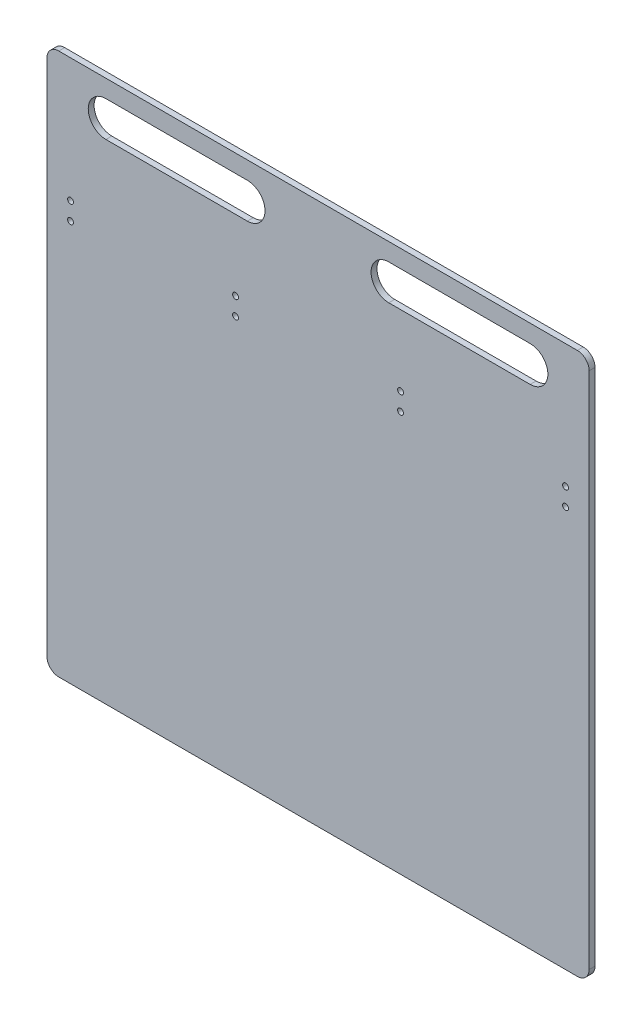
ISO-10303-21;
HEADER;
FILE_DESCRIPTION(('STEP AP214'),'2;1');
FILE_NAME('part.step','',(''),(''),'','','');
FILE_SCHEMA(('AUTOMOTIVE_DESIGN { 1 0 10303 214 1 1 1 1 }'));
ENDSEC;
DATA;
#1=APPLICATION_CONTEXT('core data for automotive mechanical design processes');
#2=APPLICATION_PROTOCOL_DEFINITION('international standard','automotive_design',2000,#1);
#3=PRODUCT_CONTEXT('',#1,'mechanical');
#4=PRODUCT('Part','Part','',(#3));
#5=PRODUCT_RELATED_PRODUCT_CATEGORY('part','',(#4));
#6=PRODUCT_DEFINITION_FORMATION('','',#4);
#7=PRODUCT_DEFINITION_CONTEXT('part definition',#1,'design');
#8=PRODUCT_DEFINITION('design','',#6,#7);
#9=PRODUCT_DEFINITION_SHAPE('','',#8);
#10=(LENGTH_UNIT() NAMED_UNIT(*) SI_UNIT(.MILLI.,.METRE.));
#11=(NAMED_UNIT(*) PLANE_ANGLE_UNIT() SI_UNIT($,.RADIAN.));
#12=(NAMED_UNIT(*) SI_UNIT($,.STERADIAN.) SOLID_ANGLE_UNIT());
#13=UNCERTAINTY_MEASURE_WITH_UNIT(LENGTH_MEASURE(1.E-05),#10,'distance_accuracy_value','');
#14=(GEOMETRIC_REPRESENTATION_CONTEXT(3) GLOBAL_UNCERTAINTY_ASSIGNED_CONTEXT((#13)) GLOBAL_UNIT_ASSIGNED_CONTEXT((#10,
#11,#12)) REPRESENTATION_CONTEXT('',''));
#15=CARTESIAN_POINT('',(0.,0.,0.));
#16=DIRECTION('',(0.,0.,1.));
#17=DIRECTION('',(1.,0.,0.));
#18=AXIS2_PLACEMENT_3D('',#15,#16,#17);
#19=CARTESIAN_POINT('',(0.,0.,6.35));
#20=DIRECTION('',(0.,0.,-1.));
#21=DIRECTION('',(-1.,0.,0.));
#22=AXIS2_PLACEMENT_3D('',#19,#20,#21);
#23=PLANE('',#22);
#24=CARTESIAN_POINT('',(-266.7,139.7,6.35));
#25=DIRECTION('',(0.,0.,1.));
#26=DIRECTION('',(1.,0.,0.));
#27=AXIS2_PLACEMENT_3D('',#24,#25,#26);
#28=CIRCLE('',#27,3.17499999999997);
#29=CARTESIAN_POINT('',(-263.525,139.7,6.35));
#30=VERTEX_POINT('',#29);
#31=EDGE_CURVE('E192',#30,#30,#28,.T.);
#32=ORIENTED_EDGE('',*,*,#31,.F.);
#33=EDGE_LOOP('',(#32));
#34=FACE_BOUND('',#33,.T.);
#35=CARTESIAN_POINT('',(76.2,254.,6.35));
#36=DIRECTION('',(0.,0.,1.));
#37=DIRECTION('',(1.,0.,0.));
#38=AXIS2_PLACEMENT_3D('',#35,#36,#37);
#39=CIRCLE('',#38,19.0499999999999);
#40=CARTESIAN_POINT('',(76.2,273.05,6.35));
#41=VERTEX_POINT('',#40);
#42=CARTESIAN_POINT('',(76.2,234.95,6.35));
#43=VERTEX_POINT('',#42);
#44=EDGE_CURVE('E198',#41,#43,#39,.T.);
#45=ORIENTED_EDGE('',*,*,#44,.F.);
#46=DIRECTION('',(-1.,0.,0.));
#47=VECTOR('',#46,1.);
#48=CARTESIAN_POINT('',(76.2,273.05,6.35));
#49=LINE('',#48,#47);
#50=CARTESIAN_POINT('',(228.6,273.05,6.35));
#51=VERTEX_POINT('',#50);
#52=EDGE_CURVE('E206',#51,#41,#49,.T.);
#53=ORIENTED_EDGE('',*,*,#52,.F.);
#54=CARTESIAN_POINT('',(228.6,254.,6.35));
#55=DIRECTION('',(0.,0.,1.));
#56=DIRECTION('',(1.,0.,0.));
#57=AXIS2_PLACEMENT_3D('',#54,#55,#56);
#58=CIRCLE('',#57,19.0499999999999);
#59=CARTESIAN_POINT('',(228.6,234.95,6.35));
#60=VERTEX_POINT('',#59);
#61=EDGE_CURVE('E203',#60,#51,#58,.T.);
#62=ORIENTED_EDGE('',*,*,#61,.F.);
#63=DIRECTION('',(1.,0.,0.));
#64=VECTOR('',#63,1.);
#65=CARTESIAN_POINT('',(76.2,234.95,6.35));
#66=LINE('',#65,#64);
#67=EDGE_CURVE('E200',#43,#60,#66,.T.);
#68=ORIENTED_EDGE('',*,*,#67,.F.);
#69=EDGE_LOOP('',(#45,#53,#62,#68));
#70=FACE_BOUND('',#69,.T.);
#71=DIRECTION('',(1.,0.,0.));
#72=VECTOR('',#71,1.);
#73=CARTESIAN_POINT('',(-292.1,-292.1,6.35));
#74=LINE('',#73,#72);
#75=CARTESIAN_POINT('',(-279.4,-292.1,6.35));
#76=VERTEX_POINT('',#75);
#77=CARTESIAN_POINT('',(279.4,-292.1,6.35));
#78=VERTEX_POINT('',#77);
#79=EDGE_CURVE('E237',#76,#78,#74,.T.);
#80=ORIENTED_EDGE('',*,*,#79,.T.);
#81=CARTESIAN_POINT('',(279.4,-279.4,6.35));
#82=DIRECTION('',(0.,0.,-1.));
#83=DIRECTION('',(-1.,0.,0.));
#84=AXIS2_PLACEMENT_3D('',#81,#82,#83);
#85=CIRCLE('',#84,12.7);
#86=CARTESIAN_POINT('',(292.1,-279.4,6.35));
#87=VERTEX_POINT('',#86);
#88=EDGE_CURVE('E272',#78,#87,#85,.F.);
#89=ORIENTED_EDGE('',*,*,#88,.T.);
#90=DIRECTION('',(0.,1.,0.));
#91=VECTOR('',#90,1.);
#92=CARTESIAN_POINT('',(292.1,-292.1,6.35));
#93=LINE('',#92,#91);
#94=CARTESIAN_POINT('',(292.1,279.4,6.35));
#95=VERTEX_POINT('',#94);
#96=EDGE_CURVE('E229',#87,#95,#93,.T.);
#97=ORIENTED_EDGE('',*,*,#96,.T.);
#98=CARTESIAN_POINT('',(279.4,279.4,6.35));
#99=DIRECTION('',(0.,0.,-1.));
#100=DIRECTION('',(-1.,0.,0.));
#101=AXIS2_PLACEMENT_3D('',#98,#99,#100);
#102=CIRCLE('',#101,12.7);
#103=CARTESIAN_POINT('',(279.4,292.1,6.35));
#104=VERTEX_POINT('',#103);
#105=EDGE_CURVE('E267',#95,#104,#102,.F.);
#106=ORIENTED_EDGE('',*,*,#105,.T.);
#107=DIRECTION('',(-1.,0.,0.));
#108=VECTOR('',#107,1.);
#109=CARTESIAN_POINT('',(-292.1,292.1,6.35));
#110=LINE('',#109,#108);
#111=CARTESIAN_POINT('',(-279.4,292.1,6.35));
#112=VERTEX_POINT('',#111);
#113=EDGE_CURVE('E232',#104,#112,#110,.T.);
#114=ORIENTED_EDGE('',*,*,#113,.T.);
#115=CARTESIAN_POINT('',(-279.4,279.4,6.35));
#116=DIRECTION('',(0.,0.,-1.));
#117=DIRECTION('',(-1.,0.,0.));
#118=AXIS2_PLACEMENT_3D('',#115,#116,#117);
#119=CIRCLE('',#118,12.7);
#120=CARTESIAN_POINT('',(-292.1,279.4,6.35));
#121=VERTEX_POINT('',#120);
#122=EDGE_CURVE('E55',#112,#121,#119,.F.);
#123=ORIENTED_EDGE('',*,*,#122,.T.);
#124=DIRECTION('',(0.,-1.,0.));
#125=VECTOR('',#124,1.);
#126=CARTESIAN_POINT('',(-292.1,-292.1,6.35));
#127=LINE('',#126,#125);
#128=CARTESIAN_POINT('',(-292.1,-279.4,6.35));
#129=VERTEX_POINT('',#128);
#130=EDGE_CURVE('E235',#121,#129,#127,.T.);
#131=ORIENTED_EDGE('',*,*,#130,.T.);
#132=CARTESIAN_POINT('',(-279.4,-279.4,6.35));
#133=DIRECTION('',(0.,0.,-1.));
#134=DIRECTION('',(-1.,0.,0.));
#135=AXIS2_PLACEMENT_3D('',#132,#133,#134);
#136=CIRCLE('',#135,12.7);
#137=EDGE_CURVE('E270',#129,#76,#136,.F.);
#138=ORIENTED_EDGE('',*,*,#137,.T.);
#139=EDGE_LOOP('',(#80,#89,#97,#106,#114,#123,#131,#138));
#140=FACE_BOUND('',#139,.T.);
#141=CARTESIAN_POINT('',(-228.6,254.,6.35));
#142=DIRECTION('',(0.,0.,1.));
#143=DIRECTION('',(1.,0.,0.));
#144=AXIS2_PLACEMENT_3D('',#141,#142,#143);
#145=CIRCLE('',#144,19.05);
#146=CARTESIAN_POINT('',(-228.6,273.05,6.35));
#147=VERTEX_POINT('',#146);
#148=CARTESIAN_POINT('',(-228.6,234.95,6.35));
#149=VERTEX_POINT('',#148);
#150=EDGE_CURVE('E148',#147,#149,#145,.T.);
#151=ORIENTED_EDGE('',*,*,#150,.F.);
#152=DIRECTION('',(-1.,0.,0.));
#153=VECTOR('',#152,1.);
#154=CARTESIAN_POINT('',(-228.6,273.05,6.35));
#155=LINE('',#154,#153);
#156=CARTESIAN_POINT('',(-76.2,273.05,6.35));
#157=VERTEX_POINT('',#156);
#158=EDGE_CURVE('E174',#157,#147,#155,.T.);
#159=ORIENTED_EDGE('',*,*,#158,.F.);
#160=CARTESIAN_POINT('',(-76.2,254.,6.35));
#161=DIRECTION('',(0.,0.,1.));
#162=DIRECTION('',(1.,0.,0.));
#163=AXIS2_PLACEMENT_3D('',#160,#161,#162);
#164=CIRCLE('',#163,19.05);
#165=CARTESIAN_POINT('',(-76.2,234.95,6.35));
#166=VERTEX_POINT('',#165);
#167=EDGE_CURVE('E172',#166,#157,#164,.T.);
#168=ORIENTED_EDGE('',*,*,#167,.F.);
#169=DIRECTION('',(1.,0.,0.));
#170=VECTOR('',#169,1.);
#171=CARTESIAN_POINT('',(-228.6,234.95,6.35));
#172=LINE('',#171,#170);
#173=EDGE_CURVE('E158',#149,#166,#172,.T.);
#174=ORIENTED_EDGE('',*,*,#173,.F.);
#175=EDGE_LOOP('',(#151,#159,#168,#174));
#176=FACE_BOUND('',#175,.T.);
#177=CARTESIAN_POINT('',(-88.9,139.7,6.35));
#178=DIRECTION('',(0.,0.,1.));
#179=DIRECTION('',(1.,0.,0.));
#180=AXIS2_PLACEMENT_3D('',#177,#178,#179);
#181=CIRCLE('',#180,3.17499999999997);
#182=CARTESIAN_POINT('',(-85.725,139.7,6.35));
#183=VERTEX_POINT('',#182);
#184=EDGE_CURVE('E181',#183,#183,#181,.T.);
#185=ORIENTED_EDGE('',*,*,#184,.F.);
#186=EDGE_LOOP('',(#185));
#187=FACE_BOUND('',#186,.T.);
#188=CARTESIAN_POINT('',(88.9,139.7,6.35));
#189=DIRECTION('',(0.,0.,1.));
#190=DIRECTION('',(1.,0.,0.));
#191=AXIS2_PLACEMENT_3D('',#188,#189,#190);
#192=CIRCLE('',#191,3.17499999999997);
#193=CARTESIAN_POINT('',(92.0749999999999,139.7,6.35));
#194=VERTEX_POINT('',#193);
#195=EDGE_CURVE('E602',#194,#194,#192,.T.);
#196=ORIENTED_EDGE('',*,*,#195,.F.);
#197=EDGE_LOOP('',(#196));
#198=FACE_BOUND('',#197,.T.);
#199=CARTESIAN_POINT('',(266.7,139.7,6.35));
#200=DIRECTION('',(0.,0.,1.));
#201=DIRECTION('',(1.,0.,0.));
#202=AXIS2_PLACEMENT_3D('',#199,#200,#201);
#203=CIRCLE('',#202,3.17499999999997);
#204=CARTESIAN_POINT('',(269.875,139.7,6.35));
#205=VERTEX_POINT('',#204);
#206=EDGE_CURVE('E597',#205,#205,#203,.T.);
#207=ORIENTED_EDGE('',*,*,#206,.F.);
#208=EDGE_LOOP('',(#207));
#209=FACE_BOUND('',#208,.T.);
#210=CARTESIAN_POINT('',(-88.9,158.75,6.35));
#211=DIRECTION('',(0.,0.,1.));
#212=DIRECTION('',(1.,0.,0.));
#213=AXIS2_PLACEMENT_3D('',#210,#211,#212);
#214=CIRCLE('',#213,3.17499999999997);
#215=CARTESIAN_POINT('',(-85.725,158.75,6.35));
#216=VERTEX_POINT('',#215);
#217=EDGE_CURVE('E592',#216,#216,#214,.T.);
#218=ORIENTED_EDGE('',*,*,#217,.F.);
#219=EDGE_LOOP('',(#218));
#220=FACE_BOUND('',#219,.T.);
#221=CARTESIAN_POINT('',(88.9,158.75,6.35));
#222=DIRECTION('',(0.,0.,1.));
#223=DIRECTION('',(1.,0.,0.));
#224=AXIS2_PLACEMENT_3D('',#221,#222,#223);
#225=CIRCLE('',#224,3.17499999999997);
#226=CARTESIAN_POINT('',(92.0749999999999,158.75,6.35));
#227=VERTEX_POINT('',#226);
#228=EDGE_CURVE('E587',#227,#227,#225,.T.);
#229=ORIENTED_EDGE('',*,*,#228,.F.);
#230=EDGE_LOOP('',(#229));
#231=FACE_BOUND('',#230,.T.);
#232=CARTESIAN_POINT('',(266.7,158.75,6.35));
#233=DIRECTION('',(0.,0.,1.));
#234=DIRECTION('',(1.,0.,0.));
#235=AXIS2_PLACEMENT_3D('',#232,#233,#234);
#236=CIRCLE('',#235,3.17499999999997);
#237=CARTESIAN_POINT('',(269.875,158.75,6.35));
#238=VERTEX_POINT('',#237);
#239=EDGE_CURVE('E582',#238,#238,#236,.T.);
#240=ORIENTED_EDGE('',*,*,#239,.F.);
#241=EDGE_LOOP('',(#240));
#242=FACE_BOUND('',#241,.T.);
#243=CARTESIAN_POINT('',(-266.7,158.75,6.35));
#244=DIRECTION('',(0.,0.,1.));
#245=DIRECTION('',(1.,0.,0.));
#246=AXIS2_PLACEMENT_3D('',#243,#244,#245);
#247=CIRCLE('',#246,3.17499999999997);
#248=CARTESIAN_POINT('',(-263.525,158.75,6.35));
#249=VERTEX_POINT('',#248);
#250=EDGE_CURVE('E576',#249,#249,#247,.T.);
#251=ORIENTED_EDGE('',*,*,#250,.F.);
#252=EDGE_LOOP('',(#251));
#253=FACE_BOUND('',#252,.T.);
#254=ADVANCED_FACE('F33',(#34,#70,#140,#176,#187,#198,#209,#220,#231,#242,#253),#23,.F.);
#255=CARTESIAN_POINT('',(0.,0.,0.));
#256=DIRECTION('',(0.,0.,-1.));
#257=DIRECTION('',(-1.,0.,0.));
#258=AXIS2_PLACEMENT_3D('',#255,#256,#257);
#259=PLANE('',#258);
#260=CARTESIAN_POINT('',(266.7,158.75,0.));
#261=DIRECTION('',(0.,0.,1.));
#262=DIRECTION('',(1.,0.,0.));
#263=AXIS2_PLACEMENT_3D('',#260,#261,#262);
#264=CIRCLE('',#263,3.17499999999997);
#265=CARTESIAN_POINT('',(269.875,158.75,0.));
#266=VERTEX_POINT('',#265);
#267=EDGE_CURVE('E579',#266,#266,#264,.T.);
#268=ORIENTED_EDGE('',*,*,#267,.T.);
#269=EDGE_LOOP('',(#268));
#270=FACE_BOUND('',#269,.T.);
#271=CARTESIAN_POINT('',(-88.9,158.75,0.));
#272=DIRECTION('',(0.,0.,1.));
#273=DIRECTION('',(1.,0.,0.));
#274=AXIS2_PLACEMENT_3D('',#271,#272,#273);
#275=CIRCLE('',#274,3.17499999999997);
#276=CARTESIAN_POINT('',(-85.725,158.75,0.));
#277=VERTEX_POINT('',#276);
#278=EDGE_CURVE('E590',#277,#277,#275,.T.);
#279=ORIENTED_EDGE('',*,*,#278,.T.);
#280=EDGE_LOOP('',(#279));
#281=FACE_BOUND('',#280,.T.);
#282=CARTESIAN_POINT('',(88.9,139.7,0.));
#283=DIRECTION('',(0.,0.,1.));
#284=DIRECTION('',(1.,0.,0.));
#285=AXIS2_PLACEMENT_3D('',#282,#283,#284);
#286=CIRCLE('',#285,3.17499999999997);
#287=CARTESIAN_POINT('',(92.0749999999999,139.7,0.));
#288=VERTEX_POINT('',#287);
#289=EDGE_CURVE('E600',#288,#288,#286,.T.);
#290=ORIENTED_EDGE('',*,*,#289,.T.);
#291=EDGE_LOOP('',(#290));
#292=FACE_BOUND('',#291,.T.);
#293=DIRECTION('',(-1.,0.,0.));
#294=VECTOR('',#293,1.);
#295=CARTESIAN_POINT('',(-228.6,273.05,0.));
#296=LINE('',#295,#294);
#297=CARTESIAN_POINT('',(-76.2,273.05,0.));
#298=VERTEX_POINT('',#297);
#299=CARTESIAN_POINT('',(-228.6,273.05,0.));
#300=VERTEX_POINT('',#299);
#301=EDGE_CURVE('E159',#298,#300,#296,.T.);
#302=ORIENTED_EDGE('',*,*,#301,.T.);
#303=CARTESIAN_POINT('',(-228.6,254.,0.));
#304=DIRECTION('',(0.,0.,1.));
#305=DIRECTION('',(1.,0.,0.));
#306=AXIS2_PLACEMENT_3D('',#303,#304,#305);
#307=CIRCLE('',#306,19.05);
#308=CARTESIAN_POINT('',(-228.6,234.95,0.));
#309=VERTEX_POINT('',#308);
#310=EDGE_CURVE('E179',#300,#309,#307,.T.);
#311=ORIENTED_EDGE('',*,*,#310,.T.);
#312=DIRECTION('',(1.,0.,0.));
#313=VECTOR('',#312,1.);
#314=CARTESIAN_POINT('',(-228.6,234.95,0.));
#315=LINE('',#314,#313);
#316=CARTESIAN_POINT('',(-76.2,234.95,0.));
#317=VERTEX_POINT('',#316);
#318=EDGE_CURVE('E165',#309,#317,#315,.T.);
#319=ORIENTED_EDGE('',*,*,#318,.T.);
#320=CARTESIAN_POINT('',(-76.2,254.,0.));
#321=DIRECTION('',(0.,0.,1.));
#322=DIRECTION('',(1.,0.,0.));
#323=AXIS2_PLACEMENT_3D('',#320,#321,#322);
#324=CIRCLE('',#323,19.05);
#325=EDGE_CURVE('E183',#317,#298,#324,.T.);
#326=ORIENTED_EDGE('',*,*,#325,.T.);
#327=EDGE_LOOP('',(#302,#311,#319,#326));
#328=FACE_BOUND('',#327,.T.);
#329=CARTESIAN_POINT('',(-266.7,139.7,0.));
#330=DIRECTION('',(0.,0.,1.));
#331=DIRECTION('',(1.,0.,0.));
#332=AXIS2_PLACEMENT_3D('',#329,#330,#331);
#333=CIRCLE('',#332,3.17499999999997);
#334=CARTESIAN_POINT('',(-263.525,139.7,0.));
#335=VERTEX_POINT('',#334);
#336=EDGE_CURVE('E166',#335,#335,#333,.T.);
#337=ORIENTED_EDGE('',*,*,#336,.T.);
#338=EDGE_LOOP('',(#337));
#339=FACE_BOUND('',#338,.T.);
#340=DIRECTION('',(0.,1.,0.));
#341=VECTOR('',#340,1.);
#342=CARTESIAN_POINT('',(292.1,-292.1,0.));
#343=LINE('',#342,#341);
#344=CARTESIAN_POINT('',(292.1,-279.4,0.));
#345=VERTEX_POINT('',#344);
#346=CARTESIAN_POINT('',(292.1,279.4,0.));
#347=VERTEX_POINT('',#346);
#348=EDGE_CURVE('E228',#345,#347,#343,.T.);
#349=ORIENTED_EDGE('',*,*,#348,.F.);
#350=CARTESIAN_POINT('',(279.4,-279.4,0.));
#351=DIRECTION('',(0.,0.,-1.));
#352=DIRECTION('',(-1.,0.,0.));
#353=AXIS2_PLACEMENT_3D('',#350,#351,#352);
#354=CIRCLE('',#353,12.7);
#355=CARTESIAN_POINT('',(279.4,-292.1,0.));
#356=VERTEX_POINT('',#355);
#357=EDGE_CURVE('E260',#345,#356,#354,.T.);
#358=ORIENTED_EDGE('',*,*,#357,.T.);
#359=DIRECTION('',(1.,0.,0.));
#360=VECTOR('',#359,1.);
#361=CARTESIAN_POINT('',(-292.1,-292.1,0.));
#362=LINE('',#361,#360);
#363=CARTESIAN_POINT('',(-279.4,-292.1,0.));
#364=VERTEX_POINT('',#363);
#365=EDGE_CURVE('E233',#364,#356,#362,.T.);
#366=ORIENTED_EDGE('',*,*,#365,.F.);
#367=CARTESIAN_POINT('',(-279.4,-279.4,0.));
#368=DIRECTION('',(0.,0.,-1.));
#369=DIRECTION('',(-1.,0.,0.));
#370=AXIS2_PLACEMENT_3D('',#367,#368,#369);
#371=CIRCLE('',#370,12.7);
#372=CARTESIAN_POINT('',(-292.1,-279.4,0.));
#373=VERTEX_POINT('',#372);
#374=EDGE_CURVE('E258',#364,#373,#371,.T.);
#375=ORIENTED_EDGE('',*,*,#374,.T.);
#376=DIRECTION('',(0.,-1.,0.));
#377=VECTOR('',#376,1.);
#378=CARTESIAN_POINT('',(-292.1,-292.1,0.));
#379=LINE('',#378,#377);
#380=CARTESIAN_POINT('',(-292.1,279.4,0.));
#381=VERTEX_POINT('',#380);
#382=EDGE_CURVE('E246',#381,#373,#379,.T.);
#383=ORIENTED_EDGE('',*,*,#382,.F.);
#384=CARTESIAN_POINT('',(-279.4,279.4,0.));
#385=DIRECTION('',(0.,0.,-1.));
#386=DIRECTION('',(-1.,0.,0.));
#387=AXIS2_PLACEMENT_3D('',#384,#385,#386);
#388=CIRCLE('',#387,12.7);
#389=CARTESIAN_POINT('',(-279.4,292.1,0.));
#390=VERTEX_POINT('',#389);
#391=EDGE_CURVE('E256',#381,#390,#388,.T.);
#392=ORIENTED_EDGE('',*,*,#391,.T.);
#393=DIRECTION('',(-1.,0.,0.));
#394=VECTOR('',#393,1.);
#395=CARTESIAN_POINT('',(-292.1,292.1,0.));
#396=LINE('',#395,#394);
#397=CARTESIAN_POINT('',(279.4,292.1,0.));
#398=VERTEX_POINT('',#397);
#399=EDGE_CURVE('E243',#398,#390,#396,.T.);
#400=ORIENTED_EDGE('',*,*,#399,.F.);
#401=CARTESIAN_POINT('',(279.4,279.4,0.));
#402=DIRECTION('',(0.,0.,-1.));
#403=DIRECTION('',(-1.,0.,0.));
#404=AXIS2_PLACEMENT_3D('',#401,#402,#403);
#405=CIRCLE('',#404,12.7);
#406=EDGE_CURVE('E254',#398,#347,#405,.T.);
#407=ORIENTED_EDGE('',*,*,#406,.T.);
#408=EDGE_LOOP('',(#349,#358,#366,#375,#383,#392,#400,#407));
#409=FACE_BOUND('',#408,.T.);
#410=DIRECTION('',(-1.,0.,0.));
#411=VECTOR('',#410,1.);
#412=CARTESIAN_POINT('',(76.2,273.05,0.));
#413=LINE('',#412,#411);
#414=CARTESIAN_POINT('',(228.6,273.05,0.));
#415=VERTEX_POINT('',#414);
#416=CARTESIAN_POINT('',(76.2,273.05,0.));
#417=VERTEX_POINT('',#416);
#418=EDGE_CURVE('E201',#415,#417,#413,.T.);
#419=ORIENTED_EDGE('',*,*,#418,.T.);
#420=CARTESIAN_POINT('',(76.2,254.,0.));
#421=DIRECTION('',(0.,0.,1.));
#422=DIRECTION('',(1.,0.,0.));
#423=AXIS2_PLACEMENT_3D('',#420,#421,#422);
#424=CIRCLE('',#423,19.0499999999999);
#425=CARTESIAN_POINT('',(76.2,234.95,0.));
#426=VERTEX_POINT('',#425);
#427=EDGE_CURVE('E195',#417,#426,#424,.T.);
#428=ORIENTED_EDGE('',*,*,#427,.T.);
#429=DIRECTION('',(1.,0.,0.));
#430=VECTOR('',#429,1.);
#431=CARTESIAN_POINT('',(76.2,234.95,0.));
#432=LINE('',#431,#430);
#433=CARTESIAN_POINT('',(228.6,234.95,0.));
#434=VERTEX_POINT('',#433);
#435=EDGE_CURVE('E211',#426,#434,#432,.T.);
#436=ORIENTED_EDGE('',*,*,#435,.T.);
#437=CARTESIAN_POINT('',(228.6,254.,0.));
#438=DIRECTION('',(0.,0.,1.));
#439=DIRECTION('',(1.,0.,0.));
#440=AXIS2_PLACEMENT_3D('',#437,#438,#439);
#441=CIRCLE('',#440,19.0499999999999);
#442=EDGE_CURVE('E214',#434,#415,#441,.T.);
#443=ORIENTED_EDGE('',*,*,#442,.T.);
#444=EDGE_LOOP('',(#419,#428,#436,#443));
#445=FACE_BOUND('',#444,.T.);
#446=CARTESIAN_POINT('',(-88.9,139.7,0.));
#447=DIRECTION('',(0.,0.,1.));
#448=DIRECTION('',(1.,0.,0.));
#449=AXIS2_PLACEMENT_3D('',#446,#447,#448);
#450=CIRCLE('',#449,3.17499999999997);
#451=CARTESIAN_POINT('',(-85.725,139.7,0.));
#452=VERTEX_POINT('',#451);
#453=EDGE_CURVE('E563',#452,#452,#450,.T.);
#454=ORIENTED_EDGE('',*,*,#453,.T.);
#455=EDGE_LOOP('',(#454));
#456=FACE_BOUND('',#455,.T.);
#457=CARTESIAN_POINT('',(266.7,139.7,0.));
#458=DIRECTION('',(0.,0.,1.));
#459=DIRECTION('',(1.,0.,0.));
#460=AXIS2_PLACEMENT_3D('',#457,#458,#459);
#461=CIRCLE('',#460,3.17499999999997);
#462=CARTESIAN_POINT('',(269.875,139.7,0.));
#463=VERTEX_POINT('',#462);
#464=EDGE_CURVE('E567',#463,#463,#461,.T.);
#465=ORIENTED_EDGE('',*,*,#464,.T.);
#466=EDGE_LOOP('',(#465));
#467=FACE_BOUND('',#466,.T.);
#468=CARTESIAN_POINT('',(88.9,158.75,0.));
#469=DIRECTION('',(0.,0.,1.));
#470=DIRECTION('',(1.,0.,0.));
#471=AXIS2_PLACEMENT_3D('',#468,#469,#470);
#472=CIRCLE('',#471,3.17499999999997);
#473=CARTESIAN_POINT('',(92.0749999999999,158.75,0.));
#474=VERTEX_POINT('',#473);
#475=EDGE_CURVE('E571',#474,#474,#472,.T.);
#476=ORIENTED_EDGE('',*,*,#475,.T.);
#477=EDGE_LOOP('',(#476));
#478=FACE_BOUND('',#477,.T.);
#479=CARTESIAN_POINT('',(-266.7,158.75,0.));
#480=DIRECTION('',(0.,0.,1.));
#481=DIRECTION('',(1.,0.,0.));
#482=AXIS2_PLACEMENT_3D('',#479,#480,#481);
#483=CIRCLE('',#482,3.17499999999997);
#484=CARTESIAN_POINT('',(-263.525,158.75,0.));
#485=VERTEX_POINT('',#484);
#486=EDGE_CURVE('E574',#485,#485,#483,.T.);
#487=ORIENTED_EDGE('',*,*,#486,.T.);
#488=EDGE_LOOP('',(#487));
#489=FACE_BOUND('',#488,.T.);
#490=ADVANCED_FACE('F288',(#270,#281,#292,#328,#339,#409,#445,#456,#467,#478,#489),#259,.T.);
#491=CARTESIAN_POINT('',(292.1,-292.1,6.35));
#492=DIRECTION('',(-1.,0.,0.));
#493=DIRECTION('',(0.,0.,1.));
#494=AXIS2_PLACEMENT_3D('',#491,#492,#493);
#495=PLANE('',#494);
#496=ORIENTED_EDGE('',*,*,#96,.F.);
#497=DIRECTION('',(0.,0.,-1.));
#498=VECTOR('',#497,1.);
#499=CARTESIAN_POINT('',(292.1,-279.4,6.35));
#500=LINE('',#499,#498);
#501=EDGE_CURVE('E251',#87,#345,#500,.T.);
#502=ORIENTED_EDGE('',*,*,#501,.T.);
#503=ORIENTED_EDGE('',*,*,#348,.T.);
#504=DIRECTION('',(0.,0.,-1.));
#505=VECTOR('',#504,1.);
#506=CARTESIAN_POINT('',(292.1,279.4,6.35));
#507=LINE('',#506,#505);
#508=EDGE_CURVE('E240',#347,#95,#507,.F.);
#509=ORIENTED_EDGE('',*,*,#508,.T.);
#510=EDGE_LOOP('',(#496,#502,#503,#509));
#511=FACE_BOUND('',#510,.T.);
#512=ADVANCED_FACE('F310',(#511),#495,.F.);
#513=CARTESIAN_POINT('',(-292.1,292.1,6.35));
#514=DIRECTION('',(0.,-1.,0.));
#515=DIRECTION('',(0.,0.,-1.));
#516=AXIS2_PLACEMENT_3D('',#513,#514,#515);
#517=PLANE('',#516);
#518=ORIENTED_EDGE('',*,*,#399,.T.);
#519=DIRECTION('',(0.,0.,-1.));
#520=VECTOR('',#519,1.);
#521=CARTESIAN_POINT('',(-279.4,292.1,6.35));
#522=LINE('',#521,#520);
#523=EDGE_CURVE('E11',#390,#112,#522,.F.);
#524=ORIENTED_EDGE('',*,*,#523,.T.);
#525=ORIENTED_EDGE('',*,*,#113,.F.);
#526=DIRECTION('',(0.,0.,-1.));
#527=VECTOR('',#526,1.);
#528=CARTESIAN_POINT('',(279.4,292.1,6.35));
#529=LINE('',#528,#527);
#530=EDGE_CURVE('E41',#104,#398,#529,.T.);
#531=ORIENTED_EDGE('',*,*,#530,.T.);
#532=EDGE_LOOP('',(#518,#524,#525,#531));
#533=FACE_BOUND('',#532,.T.);
#534=ADVANCED_FACE('F282',(#533),#517,.F.);
#535=CARTESIAN_POINT('',(-292.1,-292.1,6.35));
#536=DIRECTION('',(1.,0.,0.));
#537=DIRECTION('',(0.,0.,-1.));
#538=AXIS2_PLACEMENT_3D('',#535,#536,#537);
#539=PLANE('',#538);
#540=ORIENTED_EDGE('',*,*,#382,.T.);
#541=DIRECTION('',(0.,0.,-1.));
#542=VECTOR('',#541,1.);
#543=CARTESIAN_POINT('',(-292.1,-279.4,6.35));
#544=LINE('',#543,#542);
#545=EDGE_CURVE('E48',#373,#129,#544,.F.);
#546=ORIENTED_EDGE('',*,*,#545,.T.);
#547=ORIENTED_EDGE('',*,*,#130,.F.);
#548=DIRECTION('',(0.,0.,-1.));
#549=VECTOR('',#548,1.);
#550=CARTESIAN_POINT('',(-292.1,279.4,6.35));
#551=LINE('',#550,#549);
#552=EDGE_CURVE('E274',#121,#381,#551,.T.);
#553=ORIENTED_EDGE('',*,*,#552,.T.);
#554=EDGE_LOOP('',(#540,#546,#547,#553));
#555=FACE_BOUND('',#554,.T.);
#556=ADVANCED_FACE('F294',(#555),#539,.F.);
#557=CARTESIAN_POINT('',(-292.1,-292.1,6.35));
#558=DIRECTION('',(0.,1.,0.));
#559=DIRECTION('',(0.,0.,1.));
#560=AXIS2_PLACEMENT_3D('',#557,#558,#559);
#561=PLANE('',#560);
#562=ORIENTED_EDGE('',*,*,#365,.T.);
#563=DIRECTION('',(0.,0.,-1.));
#564=VECTOR('',#563,1.);
#565=CARTESIAN_POINT('',(279.4,-292.1,6.35));
#566=LINE('',#565,#564);
#567=EDGE_CURVE('E265',#356,#78,#566,.F.);
#568=ORIENTED_EDGE('',*,*,#567,.T.);
#569=ORIENTED_EDGE('',*,*,#79,.F.);
#570=DIRECTION('',(0.,0.,-1.));
#571=VECTOR('',#570,1.);
#572=CARTESIAN_POINT('',(-279.4,-292.1,6.35));
#573=LINE('',#572,#571);
#574=EDGE_CURVE('E262',#76,#364,#573,.T.);
#575=ORIENTED_EDGE('',*,*,#574,.T.);
#576=EDGE_LOOP('',(#562,#568,#569,#575));
#577=FACE_BOUND('',#576,.T.);
#578=ADVANCED_FACE('F302',(#577),#561,.F.);
#579=CARTESIAN_POINT('',(76.2,254.,6.35));
#580=DIRECTION('',(0.,0.,-1.));
#581=DIRECTION('',(-1.,0.,0.));
#582=AXIS2_PLACEMENT_3D('',#579,#580,#581);
#583=CYLINDRICAL_SURFACE('',#582,19.0499999999999);
#584=ORIENTED_EDGE('',*,*,#427,.F.);
#585=DIRECTION('',(0.,0.,-1.));
#586=VECTOR('',#585,1.);
#587=CARTESIAN_POINT('',(76.2,273.05,6.35));
#588=LINE('',#587,#586);
#589=EDGE_CURVE('E208',#41,#417,#588,.T.);
#590=ORIENTED_EDGE('',*,*,#589,.F.);
#591=ORIENTED_EDGE('',*,*,#44,.T.);
#592=DIRECTION('',(0.,0.,-1.));
#593=VECTOR('',#592,1.);
#594=CARTESIAN_POINT('',(76.2,234.95,6.35));
#595=LINE('',#594,#593);
#596=EDGE_CURVE('E225',#43,#426,#595,.T.);
#597=ORIENTED_EDGE('',*,*,#596,.T.);
#598=EDGE_LOOP('',(#584,#590,#591,#597));
#599=FACE_BOUND('',#598,.T.);
#600=ADVANCED_FACE('F327',(#599),#583,.F.);
#601=CARTESIAN_POINT('',(76.2,234.95,6.35));
#602=DIRECTION('',(0.,1.,0.));
#603=DIRECTION('',(-1.,0.,0.));
#604=AXIS2_PLACEMENT_3D('',#601,#602,#603);
#605=PLANE('',#604);
#606=ORIENTED_EDGE('',*,*,#435,.F.);
#607=ORIENTED_EDGE('',*,*,#596,.F.);
#608=ORIENTED_EDGE('',*,*,#67,.T.);
#609=DIRECTION('',(0.,0.,-1.));
#610=VECTOR('',#609,1.);
#611=CARTESIAN_POINT('',(228.6,234.95,6.35));
#612=LINE('',#611,#610);
#613=EDGE_CURVE('E223',#60,#434,#612,.T.);
#614=ORIENTED_EDGE('',*,*,#613,.T.);
#615=EDGE_LOOP('',(#606,#607,#608,#614));
#616=FACE_BOUND('',#615,.T.);
#617=ADVANCED_FACE('F484',(#616),#605,.T.);
#618=CARTESIAN_POINT('',(228.6,254.,6.35));
#619=DIRECTION('',(0.,0.,-1.));
#620=DIRECTION('',(-1.,0.,0.));
#621=AXIS2_PLACEMENT_3D('',#618,#619,#620);
#622=CYLINDRICAL_SURFACE('',#621,19.0499999999999);
#623=ORIENTED_EDGE('',*,*,#442,.F.);
#624=ORIENTED_EDGE('',*,*,#613,.F.);
#625=ORIENTED_EDGE('',*,*,#61,.T.);
#626=DIRECTION('',(0.,0.,-1.));
#627=VECTOR('',#626,1.);
#628=CARTESIAN_POINT('',(228.6,273.05,6.35));
#629=LINE('',#628,#627);
#630=EDGE_CURVE('E221',#51,#415,#629,.T.);
#631=ORIENTED_EDGE('',*,*,#630,.T.);
#632=EDGE_LOOP('',(#623,#624,#625,#631));
#633=FACE_BOUND('',#632,.T.);
#634=ADVANCED_FACE('F475',(#633),#622,.F.);
#635=CARTESIAN_POINT('',(76.2,273.05,6.35));
#636=DIRECTION('',(0.,-1.,0.));
#637=DIRECTION('',(1.,0.,0.));
#638=AXIS2_PLACEMENT_3D('',#635,#636,#637);
#639=PLANE('',#638);
#640=ORIENTED_EDGE('',*,*,#418,.F.);
#641=ORIENTED_EDGE('',*,*,#630,.F.);
#642=ORIENTED_EDGE('',*,*,#52,.T.);
#643=ORIENTED_EDGE('',*,*,#589,.T.);
#644=EDGE_LOOP('',(#640,#641,#642,#643));
#645=FACE_BOUND('',#644,.T.);
#646=ADVANCED_FACE('F466',(#645),#639,.T.);
#647=CARTESIAN_POINT('',(-266.7,139.7,6.35));
#648=DIRECTION('',(0.,0.,-1.));
#649=DIRECTION('',(-1.,0.,0.));
#650=AXIS2_PLACEMENT_3D('',#647,#648,#649);
#651=CYLINDRICAL_SURFACE('',#650,3.17499999999997);
#652=ORIENTED_EDGE('',*,*,#31,.T.);
#653=EDGE_LOOP('',(#652));
#654=FACE_BOUND('',#653,.T.);
#655=ORIENTED_EDGE('',*,*,#336,.F.);
#656=EDGE_LOOP('',(#655));
#657=FACE_BOUND('',#656,.T.);
#658=ADVANCED_FACE('F458',(#654,#657),#651,.F.);
#659=CARTESIAN_POINT('',(-228.6,254.,6.35));
#660=DIRECTION('',(0.,0.,-1.));
#661=DIRECTION('',(-1.,0.,0.));
#662=AXIS2_PLACEMENT_3D('',#659,#660,#661);
#663=CYLINDRICAL_SURFACE('',#662,19.05);
#664=ORIENTED_EDGE('',*,*,#310,.F.);
#665=DIRECTION('',(0.,0.,-1.));
#666=VECTOR('',#665,1.);
#667=CARTESIAN_POINT('',(-228.6,273.05,6.35));
#668=LINE('',#667,#666);
#669=EDGE_CURVE('E154',#147,#300,#668,.T.);
#670=ORIENTED_EDGE('',*,*,#669,.F.);
#671=ORIENTED_EDGE('',*,*,#150,.T.);
#672=DIRECTION('',(0.,0.,-1.));
#673=VECTOR('',#672,1.);
#674=CARTESIAN_POINT('',(-228.6,234.95,6.35));
#675=LINE('',#674,#673);
#676=EDGE_CURVE('E151',#149,#309,#675,.T.);
#677=ORIENTED_EDGE('',*,*,#676,.T.);
#678=EDGE_LOOP('',(#664,#670,#671,#677));
#679=FACE_BOUND('',#678,.T.);
#680=ADVANCED_FACE('F150',(#679),#663,.F.);
#681=CARTESIAN_POINT('',(-228.6,234.95,6.35));
#682=DIRECTION('',(0.,1.,0.));
#683=DIRECTION('',(0.,0.,1.));
#684=AXIS2_PLACEMENT_3D('',#681,#682,#683);
#685=PLANE('',#684);
#686=ORIENTED_EDGE('',*,*,#318,.F.);
#687=ORIENTED_EDGE('',*,*,#676,.F.);
#688=ORIENTED_EDGE('',*,*,#173,.T.);
#689=DIRECTION('',(0.,0.,-1.));
#690=VECTOR('',#689,1.);
#691=CARTESIAN_POINT('',(-76.2,234.95,6.35));
#692=LINE('',#691,#690);
#693=EDGE_CURVE('E167',#166,#317,#692,.T.);
#694=ORIENTED_EDGE('',*,*,#693,.T.);
#695=EDGE_LOOP('',(#686,#687,#688,#694));
#696=FACE_BOUND('',#695,.T.);
#697=ADVANCED_FACE('F162',(#696),#685,.T.);
#698=CARTESIAN_POINT('',(-76.2,254.,6.35));
#699=DIRECTION('',(0.,0.,-1.));
#700=DIRECTION('',(-1.,0.,0.));
#701=AXIS2_PLACEMENT_3D('',#698,#699,#700);
#702=CYLINDRICAL_SURFACE('',#701,19.05);
#703=ORIENTED_EDGE('',*,*,#325,.F.);
#704=ORIENTED_EDGE('',*,*,#693,.F.);
#705=ORIENTED_EDGE('',*,*,#167,.T.);
#706=DIRECTION('',(0.,0.,-1.));
#707=VECTOR('',#706,1.);
#708=CARTESIAN_POINT('',(-76.2,273.05,6.35));
#709=LINE('',#708,#707);
#710=EDGE_CURVE('E189',#157,#298,#709,.T.);
#711=ORIENTED_EDGE('',*,*,#710,.T.);
#712=EDGE_LOOP('',(#703,#704,#705,#711));
#713=FACE_BOUND('',#712,.T.);
#714=ADVANCED_FACE('F434',(#713),#702,.F.);
#715=CARTESIAN_POINT('',(-228.6,273.05,6.35));
#716=DIRECTION('',(0.,-1.,0.));
#717=DIRECTION('',(0.,0.,-1.));
#718=AXIS2_PLACEMENT_3D('',#715,#716,#717);
#719=PLANE('',#718);
#720=ORIENTED_EDGE('',*,*,#301,.F.);
#721=ORIENTED_EDGE('',*,*,#710,.F.);
#722=ORIENTED_EDGE('',*,*,#158,.T.);
#723=ORIENTED_EDGE('',*,*,#669,.T.);
#724=EDGE_LOOP('',(#720,#721,#722,#723));
#725=FACE_BOUND('',#724,.T.);
#726=ADVANCED_FACE('F425',(#725),#719,.T.);
#727=CARTESIAN_POINT('',(-88.9,139.7,6.35));
#728=DIRECTION('',(0.,0.,-1.));
#729=DIRECTION('',(-1.,0.,0.));
#730=AXIS2_PLACEMENT_3D('',#727,#728,#729);
#731=CYLINDRICAL_SURFACE('',#730,3.17499999999997);
#732=ORIENTED_EDGE('',*,*,#184,.T.);
#733=EDGE_LOOP('',(#732));
#734=FACE_BOUND('',#733,.T.);
#735=ORIENTED_EDGE('',*,*,#453,.F.);
#736=EDGE_LOOP('',(#735));
#737=FACE_BOUND('',#736,.T.);
#738=ADVANCED_FACE('F416',(#734,#737),#731,.F.);
#739=CARTESIAN_POINT('',(88.9,139.7,6.35));
#740=DIRECTION('',(0.,0.,-1.));
#741=DIRECTION('',(-1.,0.,0.));
#742=AXIS2_PLACEMENT_3D('',#739,#740,#741);
#743=CYLINDRICAL_SURFACE('',#742,3.17499999999997);
#744=ORIENTED_EDGE('',*,*,#195,.T.);
#745=EDGE_LOOP('',(#744));
#746=FACE_BOUND('',#745,.T.);
#747=ORIENTED_EDGE('',*,*,#289,.F.);
#748=EDGE_LOOP('',(#747));
#749=FACE_BOUND('',#748,.T.);
#750=ADVANCED_FACE('F407',(#746,#749),#743,.F.);
#751=CARTESIAN_POINT('',(266.7,139.7,6.35));
#752=DIRECTION('',(0.,0.,-1.));
#753=DIRECTION('',(-1.,0.,0.));
#754=AXIS2_PLACEMENT_3D('',#751,#752,#753);
#755=CYLINDRICAL_SURFACE('',#754,3.17499999999997);
#756=ORIENTED_EDGE('',*,*,#206,.T.);
#757=EDGE_LOOP('',(#756));
#758=FACE_BOUND('',#757,.T.);
#759=ORIENTED_EDGE('',*,*,#464,.F.);
#760=EDGE_LOOP('',(#759));
#761=FACE_BOUND('',#760,.T.);
#762=ADVANCED_FACE('F398',(#758,#761),#755,.F.);
#763=CARTESIAN_POINT('',(-88.9,158.75,6.35));
#764=DIRECTION('',(0.,0.,-1.));
#765=DIRECTION('',(-1.,0.,0.));
#766=AXIS2_PLACEMENT_3D('',#763,#764,#765);
#767=CYLINDRICAL_SURFACE('',#766,3.17499999999997);
#768=ORIENTED_EDGE('',*,*,#217,.T.);
#769=EDGE_LOOP('',(#768));
#770=FACE_BOUND('',#769,.T.);
#771=ORIENTED_EDGE('',*,*,#278,.F.);
#772=EDGE_LOOP('',(#771));
#773=FACE_BOUND('',#772,.T.);
#774=ADVANCED_FACE('F389',(#770,#773),#767,.F.);
#775=CARTESIAN_POINT('',(88.9,158.75,6.35));
#776=DIRECTION('',(0.,0.,-1.));
#777=DIRECTION('',(-1.,0.,0.));
#778=AXIS2_PLACEMENT_3D('',#775,#776,#777);
#779=CYLINDRICAL_SURFACE('',#778,3.17499999999997);
#780=ORIENTED_EDGE('',*,*,#228,.T.);
#781=EDGE_LOOP('',(#780));
#782=FACE_BOUND('',#781,.T.);
#783=ORIENTED_EDGE('',*,*,#475,.F.);
#784=EDGE_LOOP('',(#783));
#785=FACE_BOUND('',#784,.T.);
#786=ADVANCED_FACE('F380',(#782,#785),#779,.F.);
#787=CARTESIAN_POINT('',(266.7,158.75,6.35));
#788=DIRECTION('',(0.,0.,-1.));
#789=DIRECTION('',(-1.,0.,0.));
#790=AXIS2_PLACEMENT_3D('',#787,#788,#789);
#791=CYLINDRICAL_SURFACE('',#790,3.17499999999997);
#792=ORIENTED_EDGE('',*,*,#239,.T.);
#793=EDGE_LOOP('',(#792));
#794=FACE_BOUND('',#793,.T.);
#795=ORIENTED_EDGE('',*,*,#267,.F.);
#796=EDGE_LOOP('',(#795));
#797=FACE_BOUND('',#796,.T.);
#798=ADVANCED_FACE('F371',(#794,#797),#791,.F.);
#799=CARTESIAN_POINT('',(-266.7,158.75,6.35));
#800=DIRECTION('',(0.,0.,-1.));
#801=DIRECTION('',(-1.,0.,0.));
#802=AXIS2_PLACEMENT_3D('',#799,#800,#801);
#803=CYLINDRICAL_SURFACE('',#802,3.17499999999997);
#804=ORIENTED_EDGE('',*,*,#250,.T.);
#805=EDGE_LOOP('',(#804));
#806=FACE_BOUND('',#805,.T.);
#807=ORIENTED_EDGE('',*,*,#486,.F.);
#808=EDGE_LOOP('',(#807));
#809=FACE_BOUND('',#808,.T.);
#810=ADVANCED_FACE('F340',(#806,#809),#803,.F.);
#811=CARTESIAN_POINT('',(279.4,-279.4,6.35));
#812=DIRECTION('',(0.,0.,-1.));
#813=DIRECTION('',(-1.,0.,0.));
#814=AXIS2_PLACEMENT_3D('',#811,#812,#813);
#815=CYLINDRICAL_SURFACE('',#814,12.7);
#816=ORIENTED_EDGE('',*,*,#88,.F.);
#817=ORIENTED_EDGE('',*,*,#567,.F.);
#818=ORIENTED_EDGE('',*,*,#357,.F.);
#819=ORIENTED_EDGE('',*,*,#501,.F.);
#820=EDGE_LOOP('',(#816,#817,#818,#819));
#821=FACE_BOUND('',#820,.T.);
#822=ADVANCED_FACE('F307',(#821),#815,.T.);
#823=CARTESIAN_POINT('',(-279.4,-279.4,6.35));
#824=DIRECTION('',(0.,0.,-1.));
#825=DIRECTION('',(-1.,0.,0.));
#826=AXIS2_PLACEMENT_3D('',#823,#824,#825);
#827=CYLINDRICAL_SURFACE('',#826,12.7);
#828=ORIENTED_EDGE('',*,*,#137,.F.);
#829=ORIENTED_EDGE('',*,*,#545,.F.);
#830=ORIENTED_EDGE('',*,*,#374,.F.);
#831=ORIENTED_EDGE('',*,*,#574,.F.);
#832=EDGE_LOOP('',(#828,#829,#830,#831));
#833=FACE_BOUND('',#832,.T.);
#834=ADVANCED_FACE('F299',(#833),#827,.T.);
#835=CARTESIAN_POINT('',(-279.4,279.4,6.35));
#836=DIRECTION('',(0.,0.,-1.));
#837=DIRECTION('',(-1.,0.,0.));
#838=AXIS2_PLACEMENT_3D('',#835,#836,#837);
#839=CYLINDRICAL_SURFACE('',#838,12.7);
#840=ORIENTED_EDGE('',*,*,#122,.F.);
#841=ORIENTED_EDGE('',*,*,#523,.F.);
#842=ORIENTED_EDGE('',*,*,#391,.F.);
#843=ORIENTED_EDGE('',*,*,#552,.F.);
#844=EDGE_LOOP('',(#840,#841,#842,#843));
#845=FACE_BOUND('',#844,.T.);
#846=ADVANCED_FACE('F293',(#845),#839,.T.);
#847=CARTESIAN_POINT('',(279.4,279.4,6.35));
#848=DIRECTION('',(0.,0.,-1.));
#849=DIRECTION('',(-1.,0.,0.));
#850=AXIS2_PLACEMENT_3D('',#847,#848,#849);
#851=CYLINDRICAL_SURFACE('',#850,12.7);
#852=ORIENTED_EDGE('',*,*,#105,.F.);
#853=ORIENTED_EDGE('',*,*,#508,.F.);
#854=ORIENTED_EDGE('',*,*,#406,.F.);
#855=ORIENTED_EDGE('',*,*,#530,.F.);
#856=EDGE_LOOP('',(#852,#853,#854,#855));
#857=FACE_BOUND('',#856,.T.);
#858=ADVANCED_FACE('F35',(#857),#851,.T.);
#859=CLOSED_SHELL('',(#254,#490,#512,#534,#556,#578,#600,#617,#634,#646,#658,#680,#697,#714,
#726,#738,#750,#762,#774,#786,#798,#810,#822,#834,#846,#858));
#860=MANIFOLD_SOLID_BREP('B2',#859);
#861=ADVANCED_BREP_SHAPE_REPRESENTATION('',(#18,#860),#14);
#862=SHAPE_DEFINITION_REPRESENTATION(#9,#861);
ENDSEC;
END-ISO-10303-21;
